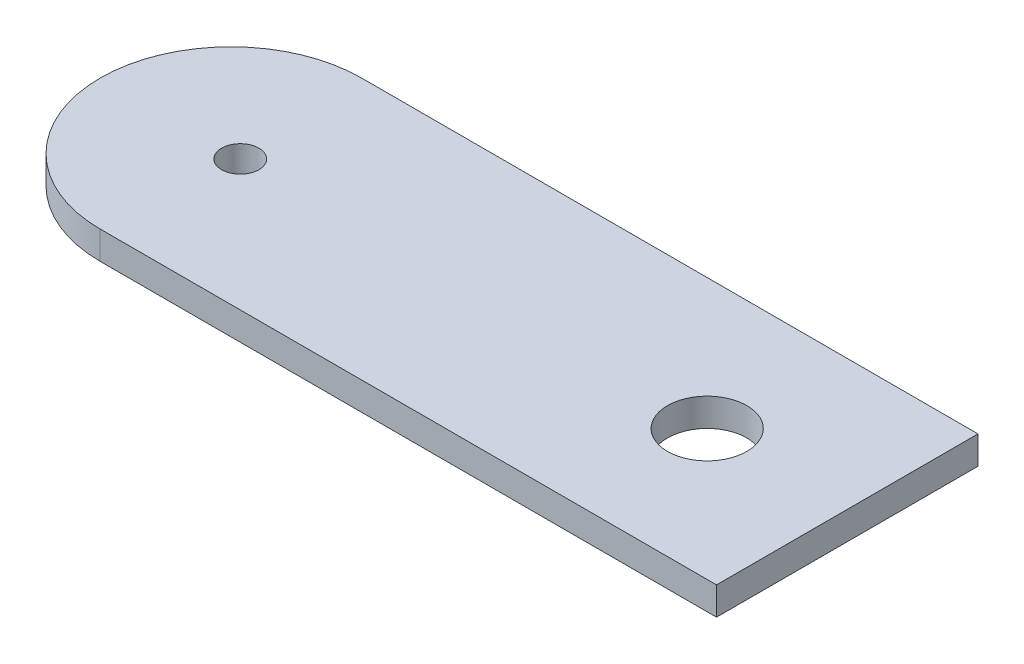
ISO-10303-21;
HEADER;
FILE_DESCRIPTION(('STEP AP214'),'2;1');
FILE_NAME('part.step','',(''),(''),'','','');
FILE_SCHEMA(('AUTOMOTIVE_DESIGN { 1 0 10303 214 1 1 1 1 }'));
ENDSEC;
DATA;
#1=APPLICATION_CONTEXT('core data for automotive mechanical design processes');
#2=APPLICATION_PROTOCOL_DEFINITION('international standard','automotive_design',2000,#1);
#3=PRODUCT_CONTEXT('',#1,'mechanical');
#4=PRODUCT('Part','Part','',(#3));
#5=PRODUCT_RELATED_PRODUCT_CATEGORY('part','',(#4));
#6=PRODUCT_DEFINITION_FORMATION('','',#4);
#7=PRODUCT_DEFINITION_CONTEXT('part definition',#1,'design');
#8=PRODUCT_DEFINITION('design','',#6,#7);
#9=PRODUCT_DEFINITION_SHAPE('','',#8);
#10=(LENGTH_UNIT() NAMED_UNIT(*) SI_UNIT(.MILLI.,.METRE.));
#11=(NAMED_UNIT(*) PLANE_ANGLE_UNIT() SI_UNIT($,.RADIAN.));
#12=(NAMED_UNIT(*) SI_UNIT($,.STERADIAN.) SOLID_ANGLE_UNIT());
#13=UNCERTAINTY_MEASURE_WITH_UNIT(LENGTH_MEASURE(1.E-05),#10,'distance_accuracy_value','');
#14=(GEOMETRIC_REPRESENTATION_CONTEXT(3) GLOBAL_UNCERTAINTY_ASSIGNED_CONTEXT((#13)) GLOBAL_UNIT_ASSIGNED_CONTEXT((#10,
#11,#12)) REPRESENTATION_CONTEXT('',''));
#15=CARTESIAN_POINT('',(0.,0.,0.));
#16=DIRECTION('',(0.,0.,1.));
#17=DIRECTION('',(1.,0.,0.));
#18=AXIS2_PLACEMENT_3D('',#15,#16,#17);
#19=CARTESIAN_POINT('',(-26.,0.,0.));
#20=DIRECTION('',(0.,-1.,0.));
#21=DIRECTION('',(0.,0.,-1.));
#22=AXIS2_PLACEMENT_3D('',#19,#20,#21);
#23=CYLINDRICAL_SURFACE('',#22,14.);
#24=DIRECTION('',(0.,-1.,0.));
#25=VECTOR('',#24,1.);
#26=CARTESIAN_POINT('',(-26.,3.,-14.));
#27=LINE('',#26,#25);
#28=CARTESIAN_POINT('',(-26.,0.,-14.));
#29=VERTEX_POINT('',#28);
#30=CARTESIAN_POINT('',(-26.,3.,-14.));
#31=VERTEX_POINT('',#30);
#32=EDGE_CURVE('E77',#29,#31,#27,.F.);
#33=ORIENTED_EDGE('',*,*,#32,.F.);
#34=CARTESIAN_POINT('',(-26.,0.,0.));
#35=DIRECTION('',(0.,1.,0.));
#36=DIRECTION('',(0.,0.,1.));
#37=AXIS2_PLACEMENT_3D('',#34,#35,#36);
#38=CIRCLE('',#37,14.);
#39=CARTESIAN_POINT('',(-26.,0.,14.));
#40=VERTEX_POINT('',#39);
#41=EDGE_CURVE('E40',#40,#29,#38,.F.);
#42=ORIENTED_EDGE('',*,*,#41,.F.);
#43=DIRECTION('',(0.,-1.,0.));
#44=VECTOR('',#43,1.);
#45=CARTESIAN_POINT('',(-26.,3.,14.));
#46=LINE('',#45,#44);
#47=CARTESIAN_POINT('',(-26.,3.,14.));
#48=VERTEX_POINT('',#47);
#49=EDGE_CURVE('E95',#48,#40,#46,.T.);
#50=ORIENTED_EDGE('',*,*,#49,.F.);
#51=CARTESIAN_POINT('',(-26.,3.,0.));
#52=DIRECTION('',(0.,1.,0.));
#53=DIRECTION('',(0.,0.,1.));
#54=AXIS2_PLACEMENT_3D('',#51,#52,#53);
#55=CIRCLE('',#54,14.);
#56=EDGE_CURVE('E11',#31,#48,#55,.T.);
#57=ORIENTED_EDGE('',*,*,#56,.F.);
#58=EDGE_LOOP('',(#33,#42,#50,#57));
#59=FACE_BOUND('',#58,.T.);
#60=ADVANCED_FACE('F33',(#59),#23,.T.);
#61=CARTESIAN_POINT('',(0.,3.,0.));
#62=DIRECTION('',(0.,1.,0.));
#63=DIRECTION('',(0.,0.,1.));
#64=AXIS2_PLACEMENT_3D('',#61,#62,#63);
#65=PLANE('',#64);
#66=CARTESIAN_POINT('',(25.,3.,0.));
#67=DIRECTION('',(0.,1.,0.));
#68=DIRECTION('',(0.,0.,1.));
#69=AXIS2_PLACEMENT_3D('',#66,#67,#68);
#70=CIRCLE('',#69,4.25000000000001);
#71=CARTESIAN_POINT('',(25.,3.,4.25000000000001));
#72=VERTEX_POINT('',#71);
#73=EDGE_CURVE('E106',#72,#72,#70,.T.);
#74=ORIENTED_EDGE('',*,*,#73,.F.);
#75=EDGE_LOOP('',(#74));
#76=FACE_BOUND('',#75,.T.);
#77=DIRECTION('',(-1.,0.,0.));
#78=VECTOR('',#77,1.);
#79=CARTESIAN_POINT('',(-40.,3.,-14.));
#80=LINE('',#79,#78);
#81=CARTESIAN_POINT('',(40.,3.,-14.));
#82=VERTEX_POINT('',#81);
#83=EDGE_CURVE('E70',#82,#31,#80,.T.);
#84=ORIENTED_EDGE('',*,*,#83,.T.);
#85=ORIENTED_EDGE('',*,*,#56,.T.);
#86=DIRECTION('',(1.,0.,0.));
#87=VECTOR('',#86,1.);
#88=CARTESIAN_POINT('',(-40.,3.,14.));
#89=LINE('',#88,#87);
#90=CARTESIAN_POINT('',(40.,3.,14.));
#91=VERTEX_POINT('',#90);
#92=EDGE_CURVE('E78',#48,#91,#89,.T.);
#93=ORIENTED_EDGE('',*,*,#92,.T.);
#94=DIRECTION('',(0.,0.,-1.));
#95=VECTOR('',#94,1.);
#96=CARTESIAN_POINT('',(40.,3.,-14.));
#97=LINE('',#96,#95);
#98=EDGE_CURVE('E79',#91,#82,#97,.T.);
#99=ORIENTED_EDGE('',*,*,#98,.T.);
#100=EDGE_LOOP('',(#84,#85,#93,#99));
#101=FACE_BOUND('',#100,.T.);
#102=CARTESIAN_POINT('',(-25.,3.,0.));
#103=DIRECTION('',(0.,1.,0.));
#104=DIRECTION('',(0.,0.,1.));
#105=AXIS2_PLACEMENT_3D('',#102,#103,#104);
#106=CIRCLE('',#105,2.);
#107=CARTESIAN_POINT('',(-25.,3.,2.));
#108=VERTEX_POINT('',#107);
#109=EDGE_CURVE('E113',#108,#108,#106,.T.);
#110=ORIENTED_EDGE('',*,*,#109,.F.);
#111=EDGE_LOOP('',(#110));
#112=FACE_BOUND('',#111,.T.);
#113=ADVANCED_FACE('F82',(#76,#101,#112),#65,.T.);
#114=CARTESIAN_POINT('',(0.,0.,0.));
#115=DIRECTION('',(0.,1.,0.));
#116=DIRECTION('',(0.,0.,1.));
#117=AXIS2_PLACEMENT_3D('',#114,#115,#116);
#118=PLANE('',#117);
#119=CARTESIAN_POINT('',(25.,0.,0.));
#120=DIRECTION('',(0.,1.,0.));
#121=DIRECTION('',(0.,0.,1.));
#122=AXIS2_PLACEMENT_3D('',#119,#120,#121);
#123=CIRCLE('',#122,4.25000000000001);
#124=CARTESIAN_POINT('',(25.,0.,4.25000000000001));
#125=VERTEX_POINT('',#124);
#126=EDGE_CURVE('E110',#125,#125,#123,.T.);
#127=ORIENTED_EDGE('',*,*,#126,.T.);
#128=EDGE_LOOP('',(#127));
#129=FACE_BOUND('',#128,.T.);
#130=DIRECTION('',(1.,0.,0.));
#131=VECTOR('',#130,1.);
#132=CARTESIAN_POINT('',(-40.,0.,14.));
#133=LINE('',#132,#131);
#134=CARTESIAN_POINT('',(40.,0.,14.));
#135=VERTEX_POINT('',#134);
#136=EDGE_CURVE('E88',#40,#135,#133,.T.);
#137=ORIENTED_EDGE('',*,*,#136,.F.);
#138=ORIENTED_EDGE('',*,*,#41,.T.);
#139=DIRECTION('',(-1.,0.,0.));
#140=VECTOR('',#139,1.);
#141=CARTESIAN_POINT('',(-40.,0.,-14.));
#142=LINE('',#141,#140);
#143=CARTESIAN_POINT('',(40.,0.,-14.));
#144=VERTEX_POINT('',#143);
#145=EDGE_CURVE('E104',#144,#29,#142,.T.);
#146=ORIENTED_EDGE('',*,*,#145,.F.);
#147=DIRECTION('',(0.,0.,-1.));
#148=VECTOR('',#147,1.);
#149=CARTESIAN_POINT('',(40.,0.,-14.));
#150=LINE('',#149,#148);
#151=EDGE_CURVE('E92',#135,#144,#150,.T.);
#152=ORIENTED_EDGE('',*,*,#151,.F.);
#153=EDGE_LOOP('',(#137,#138,#146,#152));
#154=FACE_BOUND('',#153,.T.);
#155=CARTESIAN_POINT('',(-25.,0.,0.));
#156=DIRECTION('',(0.,1.,0.));
#157=DIRECTION('',(0.,0.,1.));
#158=AXIS2_PLACEMENT_3D('',#155,#156,#157);
#159=CIRCLE('',#158,2.);
#160=CARTESIAN_POINT('',(-25.,0.,2.));
#161=VERTEX_POINT('',#160);
#162=EDGE_CURVE('E116',#161,#161,#159,.T.);
#163=ORIENTED_EDGE('',*,*,#162,.T.);
#164=EDGE_LOOP('',(#163));
#165=FACE_BOUND('',#164,.T.);
#166=ADVANCED_FACE('F102',(#129,#154,#165),#118,.F.);
#167=CARTESIAN_POINT('',(40.,3.,-14.));
#168=DIRECTION('',(-1.,0.,0.));
#169=DIRECTION('',(0.,0.,1.));
#170=AXIS2_PLACEMENT_3D('',#167,#168,#169);
#171=PLANE('',#170);
#172=ORIENTED_EDGE('',*,*,#151,.T.);
#173=DIRECTION('',(0.,-1.,0.));
#174=VECTOR('',#173,1.);
#175=CARTESIAN_POINT('',(40.,3.,-14.));
#176=LINE('',#175,#174);
#177=EDGE_CURVE('E75',#82,#144,#176,.T.);
#178=ORIENTED_EDGE('',*,*,#177,.F.);
#179=ORIENTED_EDGE('',*,*,#98,.F.);
#180=DIRECTION('',(0.,-1.,0.));
#181=VECTOR('',#180,1.);
#182=CARTESIAN_POINT('',(40.,3.,14.));
#183=LINE('',#182,#181);
#184=EDGE_CURVE('E93',#91,#135,#183,.T.);
#185=ORIENTED_EDGE('',*,*,#184,.T.);
#186=EDGE_LOOP('',(#172,#178,#179,#185));
#187=FACE_BOUND('',#186,.T.);
#188=ADVANCED_FACE('F90',(#187),#171,.F.);
#189=CARTESIAN_POINT('',(-40.,3.,-14.));
#190=DIRECTION('',(0.,0.,1.));
#191=DIRECTION('',(1.,0.,0.));
#192=AXIS2_PLACEMENT_3D('',#189,#190,#191);
#193=PLANE('',#192);
#194=ORIENTED_EDGE('',*,*,#145,.T.);
#195=ORIENTED_EDGE('',*,*,#32,.T.);
#196=ORIENTED_EDGE('',*,*,#83,.F.);
#197=ORIENTED_EDGE('',*,*,#177,.T.);
#198=EDGE_LOOP('',(#194,#195,#196,#197));
#199=FACE_BOUND('',#198,.T.);
#200=ADVANCED_FACE('F73',(#199),#193,.F.);
#201=CARTESIAN_POINT('',(-40.,3.,14.));
#202=DIRECTION('',(0.,0.,-1.));
#203=DIRECTION('',(-1.,0.,0.));
#204=AXIS2_PLACEMENT_3D('',#201,#202,#203);
#205=PLANE('',#204);
#206=ORIENTED_EDGE('',*,*,#92,.F.);
#207=ORIENTED_EDGE('',*,*,#49,.T.);
#208=ORIENTED_EDGE('',*,*,#136,.T.);
#209=ORIENTED_EDGE('',*,*,#184,.F.);
#210=EDGE_LOOP('',(#206,#207,#208,#209));
#211=FACE_BOUND('',#210,.T.);
#212=ADVANCED_FACE('F138',(#211),#205,.F.);
#213=CARTESIAN_POINT('',(25.,3.,0.));
#214=DIRECTION('',(0.,-1.,0.));
#215=DIRECTION('',(0.,0.,-1.));
#216=AXIS2_PLACEMENT_3D('',#213,#214,#215);
#217=CYLINDRICAL_SURFACE('',#216,4.25000000000001);
#218=ORIENTED_EDGE('',*,*,#73,.T.);
#219=EDGE_LOOP('',(#218));
#220=FACE_BOUND('',#219,.T.);
#221=ORIENTED_EDGE('',*,*,#126,.F.);
#222=EDGE_LOOP('',(#221));
#223=FACE_BOUND('',#222,.T.);
#224=ADVANCED_FACE('F135',(#220,#223),#217,.F.);
#225=CARTESIAN_POINT('',(-25.,3.,0.));
#226=DIRECTION('',(0.,-1.,0.));
#227=DIRECTION('',(0.,0.,-1.));
#228=AXIS2_PLACEMENT_3D('',#225,#226,#227);
#229=CYLINDRICAL_SURFACE('',#228,2.);
#230=ORIENTED_EDGE('',*,*,#109,.T.);
#231=EDGE_LOOP('',(#230));
#232=FACE_BOUND('',#231,.T.);
#233=ORIENTED_EDGE('',*,*,#162,.F.);
#234=EDGE_LOOP('',(#233));
#235=FACE_BOUND('',#234,.T.);
#236=ADVANCED_FACE('F122',(#232,#235),#229,.F.);
#237=CLOSED_SHELL('',(#60,#113,#166,#188,#200,#212,#224,#236));
#238=MANIFOLD_SOLID_BREP('B2',#237);
#239=ADVANCED_BREP_SHAPE_REPRESENTATION('',(#18,#238),#14);
#240=SHAPE_DEFINITION_REPRESENTATION(#9,#239);
ENDSEC;
END-ISO-10303-21;
